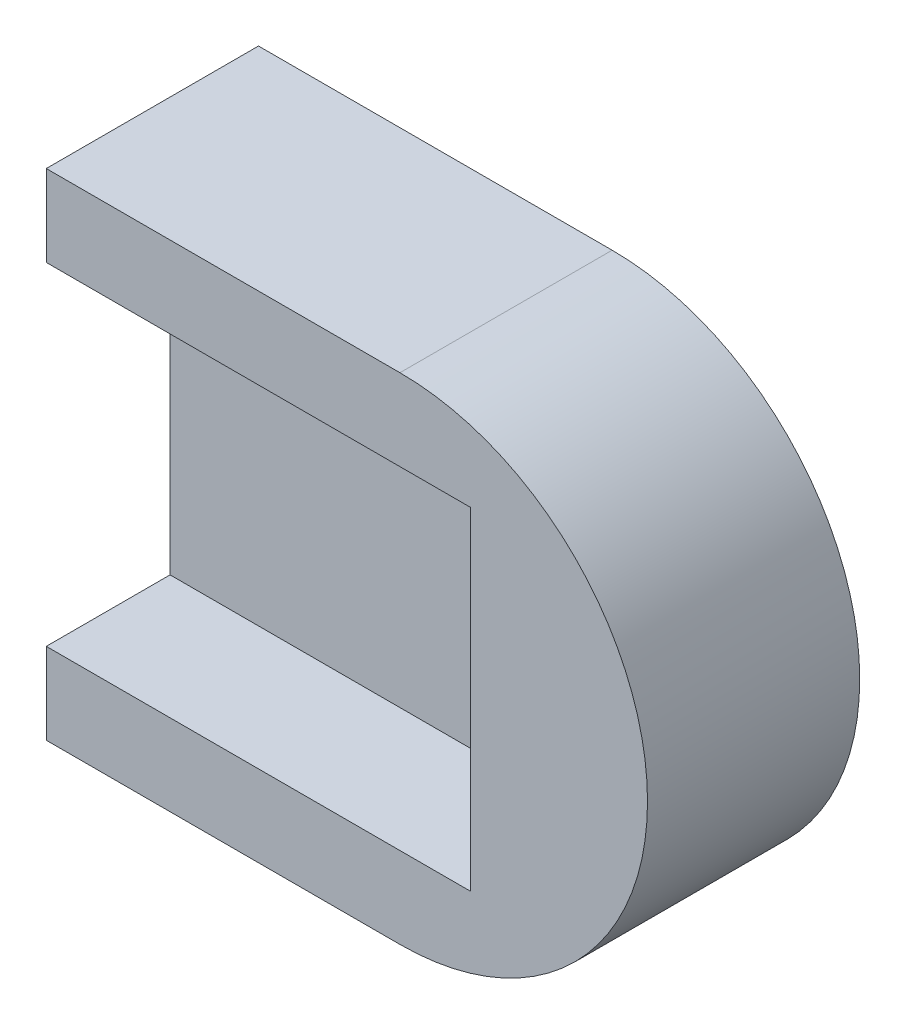
ISO-10303-21;
HEADER;
FILE_DESCRIPTION(('STEP AP214'),'2;1');
FILE_NAME('part.step','',(''),(''),'','','');
FILE_SCHEMA(('AUTOMOTIVE_DESIGN { 1 0 10303 214 1 1 1 1 }'));
ENDSEC;
DATA;
#1=APPLICATION_CONTEXT('core data for automotive mechanical design processes');
#2=APPLICATION_PROTOCOL_DEFINITION('international standard','automotive_design',2000,#1);
#3=PRODUCT_CONTEXT('',#1,'mechanical');
#4=PRODUCT('Part','Part','',(#3));
#5=PRODUCT_RELATED_PRODUCT_CATEGORY('part','',(#4));
#6=PRODUCT_DEFINITION_FORMATION('','',#4);
#7=PRODUCT_DEFINITION_CONTEXT('part definition',#1,'design');
#8=PRODUCT_DEFINITION('design','',#6,#7);
#9=PRODUCT_DEFINITION_SHAPE('','',#8);
#10=(LENGTH_UNIT() NAMED_UNIT(*) SI_UNIT(.MILLI.,.METRE.));
#11=(NAMED_UNIT(*) PLANE_ANGLE_UNIT() SI_UNIT($,.RADIAN.));
#12=(NAMED_UNIT(*) SI_UNIT($,.STERADIAN.) SOLID_ANGLE_UNIT());
#13=UNCERTAINTY_MEASURE_WITH_UNIT(LENGTH_MEASURE(1.E-05),#10,'distance_accuracy_value','');
#14=(GEOMETRIC_REPRESENTATION_CONTEXT(3) GLOBAL_UNCERTAINTY_ASSIGNED_CONTEXT((#13)) GLOBAL_UNIT_ASSIGNED_CONTEXT((#10,
#11,#12)) REPRESENTATION_CONTEXT('',''));
#15=CARTESIAN_POINT('',(0.,0.,0.));
#16=DIRECTION('',(0.,0.,1.));
#17=DIRECTION('',(1.,0.,0.));
#18=AXIS2_PLACEMENT_3D('',#15,#16,#17);
#19=CARTESIAN_POINT('',(-50.,70.,60.));
#20=DIRECTION('',(1.,0.,0.));
#21=DIRECTION('',(0.,0.,-1.));
#22=AXIS2_PLACEMENT_3D('',#19,#20,#21);
#23=PLANE('',#22);
#24=DIRECTION('',(0.,-1.,0.));
#25=VECTOR('',#24,1.);
#26=CARTESIAN_POINT('',(-50.,46.9999999999999,25.));
#27=LINE('',#26,#25);
#28=CARTESIAN_POINT('',(-50.,46.9999999999999,25.));
#29=VERTEX_POINT('',#28);
#30=CARTESIAN_POINT('',(-50.,-47.,25.));
#31=VERTEX_POINT('',#30);
#32=EDGE_CURVE('E117',#29,#31,#27,.T.);
#33=ORIENTED_EDGE('',*,*,#32,.F.);
#34=DIRECTION('',(0.,0.,1.));
#35=VECTOR('',#34,1.);
#36=CARTESIAN_POINT('',(-50.,46.9999999999999,25.));
#37=LINE('',#36,#35);
#38=CARTESIAN_POINT('',(-50.,46.9999999999999,60.));
#39=VERTEX_POINT('',#38);
#40=EDGE_CURVE('E147',#29,#39,#37,.T.);
#41=ORIENTED_EDGE('',*,*,#40,.T.);
#42=DIRECTION('',(0.,-1.,0.));
#43=VECTOR('',#42,1.);
#44=CARTESIAN_POINT('',(-50.,70.,60.));
#45=LINE('',#44,#43);
#46=CARTESIAN_POINT('',(-50.,70.,60.));
#47=VERTEX_POINT('',#46);
#48=EDGE_CURVE('E135',#47,#39,#45,.T.);
#49=ORIENTED_EDGE('',*,*,#48,.F.);
#50=DIRECTION('',(0.,0.,-1.));
#51=VECTOR('',#50,1.);
#52=CARTESIAN_POINT('',(-50.,70.,60.));
#53=LINE('',#52,#51);
#54=CARTESIAN_POINT('',(-50.,70.,0.));
#55=VERTEX_POINT('',#54);
#56=EDGE_CURVE('E142',#47,#55,#53,.T.);
#57=ORIENTED_EDGE('',*,*,#56,.T.);
#58=DIRECTION('',(0.,-1.,0.));
#59=VECTOR('',#58,1.);
#60=CARTESIAN_POINT('',(-50.,70.,0.));
#61=LINE('',#60,#59);
#62=CARTESIAN_POINT('',(-50.,-70.,0.));
#63=VERTEX_POINT('',#62);
#64=EDGE_CURVE('E143',#55,#63,#61,.T.);
#65=ORIENTED_EDGE('',*,*,#64,.T.);
#66=DIRECTION('',(0.,0.,-1.));
#67=VECTOR('',#66,1.);
#68=CARTESIAN_POINT('',(-50.,-70.,60.));
#69=LINE('',#68,#67);
#70=CARTESIAN_POINT('',(-50.,-70.,60.));
#71=VERTEX_POINT('',#70);
#72=EDGE_CURVE('E11',#71,#63,#69,.T.);
#73=ORIENTED_EDGE('',*,*,#72,.F.);
#74=CARTESIAN_POINT('',(-50.,-47.,60.));
#75=VERTEX_POINT('',#74);
#76=EDGE_CURVE('E87',#75,#71,#45,.T.);
#77=ORIENTED_EDGE('',*,*,#76,.F.);
#78=DIRECTION('',(0.,0.,1.));
#79=VECTOR('',#78,1.);
#80=CARTESIAN_POINT('',(-50.,-47.,25.));
#81=LINE('',#80,#79);
#82=EDGE_CURVE('E51',#31,#75,#81,.T.);
#83=ORIENTED_EDGE('',*,*,#82,.F.);
#84=EDGE_LOOP('',(#33,#41,#49,#57,#65,#73,#77,#83));
#85=FACE_BOUND('',#84,.T.);
#86=ADVANCED_FACE('F37',(#85),#23,.F.);
#87=CARTESIAN_POINT('',(-50.,-70.,60.));
#88=DIRECTION('',(0.,1.,0.));
#89=DIRECTION('',(0.,0.,1.));
#90=AXIS2_PLACEMENT_3D('',#87,#88,#89);
#91=PLANE('',#90);
#92=DIRECTION('',(1.,0.,0.));
#93=VECTOR('',#92,1.);
#94=CARTESIAN_POINT('',(-50.,-70.,0.));
#95=LINE('',#94,#93);
#96=CARTESIAN_POINT('',(50.,-70.,0.));
#97=VERTEX_POINT('',#96);
#98=EDGE_CURVE('E146',#63,#97,#95,.T.);
#99=ORIENTED_EDGE('',*,*,#98,.T.);
#100=DIRECTION('',(0.,0.,-1.));
#101=VECTOR('',#100,1.);
#102=CARTESIAN_POINT('',(50.,-70.,60.));
#103=LINE('',#102,#101);
#104=CARTESIAN_POINT('',(50.,-70.,60.));
#105=VERTEX_POINT('',#104);
#106=EDGE_CURVE('E44',#105,#97,#103,.T.);
#107=ORIENTED_EDGE('',*,*,#106,.F.);
#108=DIRECTION('',(1.,0.,0.));
#109=VECTOR('',#108,1.);
#110=CARTESIAN_POINT('',(-50.,-70.,60.));
#111=LINE('',#110,#109);
#112=EDGE_CURVE('E137',#71,#105,#111,.T.);
#113=ORIENTED_EDGE('',*,*,#112,.F.);
#114=ORIENTED_EDGE('',*,*,#72,.T.);
#115=EDGE_LOOP('',(#99,#107,#113,#114));
#116=FACE_BOUND('',#115,.T.);
#117=ADVANCED_FACE('F175',(#116),#91,.F.);
#118=CARTESIAN_POINT('',(50.,0.,60.));
#119=DIRECTION('',(0.,0.,-1.));
#120=DIRECTION('',(-1.,0.,0.));
#121=AXIS2_PLACEMENT_3D('',#118,#119,#120);
#122=CYLINDRICAL_SURFACE('',#121,70.);
#123=CARTESIAN_POINT('',(50.,0.,0.));
#124=DIRECTION('',(0.,0.,1.));
#125=DIRECTION('',(-1.,0.,0.));
#126=AXIS2_PLACEMENT_3D('',#123,#124,#125);
#127=CIRCLE('',#126,70.);
#128=CARTESIAN_POINT('',(50.,70.,0.));
#129=VERTEX_POINT('',#128);
#130=EDGE_CURVE('E149',#97,#129,#127,.T.);
#131=ORIENTED_EDGE('',*,*,#130,.T.);
#132=DIRECTION('',(0.,0.,-1.));
#133=VECTOR('',#132,1.);
#134=CARTESIAN_POINT('',(50.,70.,60.));
#135=LINE('',#134,#133);
#136=CARTESIAN_POINT('',(50.,70.,60.));
#137=VERTEX_POINT('',#136);
#138=EDGE_CURVE('E153',#137,#129,#135,.T.);
#139=ORIENTED_EDGE('',*,*,#138,.F.);
#140=CARTESIAN_POINT('',(50.,0.,60.));
#141=DIRECTION('',(0.,0.,1.));
#142=DIRECTION('',(-1.,0.,0.));
#143=AXIS2_PLACEMENT_3D('',#140,#141,#142);
#144=CIRCLE('',#143,70.);
#145=EDGE_CURVE('E139',#105,#137,#144,.T.);
#146=ORIENTED_EDGE('',*,*,#145,.F.);
#147=ORIENTED_EDGE('',*,*,#106,.T.);
#148=EDGE_LOOP('',(#131,#139,#146,#147));
#149=FACE_BOUND('',#148,.T.);
#150=ADVANCED_FACE('F159',(#149),#122,.T.);
#151=CARTESIAN_POINT('',(-50.,70.,60.));
#152=DIRECTION('',(0.,-1.,0.));
#153=DIRECTION('',(0.,0.,-1.));
#154=AXIS2_PLACEMENT_3D('',#151,#152,#153);
#155=PLANE('',#154);
#156=DIRECTION('',(-1.,0.,0.));
#157=VECTOR('',#156,1.);
#158=CARTESIAN_POINT('',(-50.,70.,0.));
#159=LINE('',#158,#157);
#160=EDGE_CURVE('E81',#129,#55,#159,.T.);
#161=ORIENTED_EDGE('',*,*,#160,.T.);
#162=ORIENTED_EDGE('',*,*,#56,.F.);
#163=DIRECTION('',(-1.,0.,0.));
#164=VECTOR('',#163,1.);
#165=CARTESIAN_POINT('',(-50.,70.,60.));
#166=LINE('',#165,#164);
#167=EDGE_CURVE('E60',#137,#47,#166,.T.);
#168=ORIENTED_EDGE('',*,*,#167,.F.);
#169=ORIENTED_EDGE('',*,*,#138,.T.);
#170=EDGE_LOOP('',(#161,#162,#168,#169));
#171=FACE_BOUND('',#170,.T.);
#172=ADVANCED_FACE('F166',(#171),#155,.F.);
#173=CARTESIAN_POINT('',(50.,0.,60.));
#174=DIRECTION('',(0.,0.,-1.));
#175=DIRECTION('',(-1.,0.,0.));
#176=AXIS2_PLACEMENT_3D('',#173,#174,#175);
#177=PLANE('',#176);
#178=ORIENTED_EDGE('',*,*,#48,.T.);
#179=DIRECTION('',(-1.,0.,0.));
#180=VECTOR('',#179,1.);
#181=CARTESIAN_POINT('',(-50.,46.9999999999999,60.));
#182=LINE('',#181,#180);
#183=CARTESIAN_POINT('',(70.,47.,60.));
#184=VERTEX_POINT('',#183);
#185=EDGE_CURVE('E126',#184,#39,#182,.T.);
#186=ORIENTED_EDGE('',*,*,#185,.F.);
#187=DIRECTION('',(0.,1.,0.));
#188=VECTOR('',#187,1.);
#189=CARTESIAN_POINT('',(70.,47.,60.));
#190=LINE('',#189,#188);
#191=CARTESIAN_POINT('',(70.,-47.,60.));
#192=VERTEX_POINT('',#191);
#193=EDGE_CURVE('E187',#192,#184,#190,.T.);
#194=ORIENTED_EDGE('',*,*,#193,.F.);
#195=DIRECTION('',(1.,0.,0.));
#196=VECTOR('',#195,1.);
#197=CARTESIAN_POINT('',(-50.,-47.,60.));
#198=LINE('',#197,#196);
#199=EDGE_CURVE('E190',#75,#192,#198,.T.);
#200=ORIENTED_EDGE('',*,*,#199,.F.);
#201=ORIENTED_EDGE('',*,*,#76,.T.);
#202=ORIENTED_EDGE('',*,*,#112,.T.);
#203=ORIENTED_EDGE('',*,*,#145,.T.);
#204=ORIENTED_EDGE('',*,*,#167,.T.);
#205=EDGE_LOOP('',(#178,#186,#194,#200,#201,#202,#203,#204));
#206=FACE_BOUND('',#205,.T.);
#207=ADVANCED_FACE('F168',(#206),#177,.F.);
#208=CARTESIAN_POINT('',(50.,0.,0.));
#209=DIRECTION('',(0.,0.,-1.));
#210=DIRECTION('',(-1.,0.,0.));
#211=AXIS2_PLACEMENT_3D('',#208,#209,#210);
#212=PLANE('',#211);
#213=CARTESIAN_POINT('',(30.,0.,0.));
#214=DIRECTION('',(0.,0.,-1.));
#215=DIRECTION('',(-1.,0.,0.));
#216=AXIS2_PLACEMENT_3D('',#213,#214,#215);
#217=CIRCLE('',#216,20.);
#218=CARTESIAN_POINT('',(10.,0.,0.));
#219=VERTEX_POINT('',#218);
#220=EDGE_CURVE('E199',#219,#219,#217,.T.);
#221=ORIENTED_EDGE('',*,*,#220,.F.);
#222=EDGE_LOOP('',(#221));
#223=FACE_BOUND('',#222,.T.);
#224=ORIENTED_EDGE('',*,*,#64,.F.);
#225=ORIENTED_EDGE('',*,*,#160,.F.);
#226=ORIENTED_EDGE('',*,*,#130,.F.);
#227=ORIENTED_EDGE('',*,*,#98,.F.);
#228=EDGE_LOOP('',(#224,#225,#226,#227));
#229=FACE_BOUND('',#228,.T.);
#230=ADVANCED_FACE('F164',(#223,#229),#212,.T.);
#231=CARTESIAN_POINT('',(-50.,46.9999999999999,25.));
#232=DIRECTION('',(0.,1.,0.));
#233=DIRECTION('',(-1.,0.,0.));
#234=AXIS2_PLACEMENT_3D('',#231,#232,#233);
#235=PLANE('',#234);
#236=ORIENTED_EDGE('',*,*,#185,.T.);
#237=ORIENTED_EDGE('',*,*,#40,.F.);
#238=DIRECTION('',(-1.,0.,0.));
#239=VECTOR('',#238,1.);
#240=CARTESIAN_POINT('',(-50.,46.9999999999999,25.));
#241=LINE('',#240,#239);
#242=CARTESIAN_POINT('',(70.,47.,25.));
#243=VERTEX_POINT('',#242);
#244=EDGE_CURVE('E123',#243,#29,#241,.T.);
#245=ORIENTED_EDGE('',*,*,#244,.F.);
#246=DIRECTION('',(0.,0.,1.));
#247=VECTOR('',#246,1.);
#248=CARTESIAN_POINT('',(70.,47.,25.));
#249=LINE('',#248,#247);
#250=EDGE_CURVE('E130',#243,#184,#249,.T.);
#251=ORIENTED_EDGE('',*,*,#250,.T.);
#252=EDGE_LOOP('',(#236,#237,#245,#251));
#253=FACE_BOUND('',#252,.T.);
#254=ADVANCED_FACE('F194',(#253),#235,.F.);
#255=CARTESIAN_POINT('',(70.,47.,25.));
#256=DIRECTION('',(1.,0.,0.));
#257=DIRECTION('',(0.,1.,0.));
#258=AXIS2_PLACEMENT_3D('',#255,#256,#257);
#259=PLANE('',#258);
#260=ORIENTED_EDGE('',*,*,#193,.T.);
#261=ORIENTED_EDGE('',*,*,#250,.F.);
#262=DIRECTION('',(0.,1.,0.));
#263=VECTOR('',#262,1.);
#264=CARTESIAN_POINT('',(70.,47.,25.));
#265=LINE('',#264,#263);
#266=CARTESIAN_POINT('',(70.,-47.,25.));
#267=VERTEX_POINT('',#266);
#268=EDGE_CURVE('E116',#267,#243,#265,.T.);
#269=ORIENTED_EDGE('',*,*,#268,.F.);
#270=DIRECTION('',(0.,0.,1.));
#271=VECTOR('',#270,1.);
#272=CARTESIAN_POINT('',(70.,-47.,25.));
#273=LINE('',#272,#271);
#274=EDGE_CURVE('E112',#267,#192,#273,.T.);
#275=ORIENTED_EDGE('',*,*,#274,.T.);
#276=EDGE_LOOP('',(#260,#261,#269,#275));
#277=FACE_BOUND('',#276,.T.);
#278=ADVANCED_FACE('F196',(#277),#259,.F.);
#279=CARTESIAN_POINT('',(-50.,-47.,25.));
#280=DIRECTION('',(0.,-1.,0.));
#281=DIRECTION('',(0.,0.,-1.));
#282=AXIS2_PLACEMENT_3D('',#279,#280,#281);
#283=PLANE('',#282);
#284=ORIENTED_EDGE('',*,*,#199,.T.);
#285=ORIENTED_EDGE('',*,*,#274,.F.);
#286=DIRECTION('',(1.,0.,0.));
#287=VECTOR('',#286,1.);
#288=CARTESIAN_POINT('',(-50.,-47.,25.));
#289=LINE('',#288,#287);
#290=EDGE_CURVE('E109',#31,#267,#289,.T.);
#291=ORIENTED_EDGE('',*,*,#290,.F.);
#292=ORIENTED_EDGE('',*,*,#82,.T.);
#293=EDGE_LOOP('',(#284,#285,#291,#292));
#294=FACE_BOUND('',#293,.T.);
#295=ADVANCED_FACE('F111',(#294),#283,.F.);
#296=CARTESIAN_POINT('',(0.,0.,25.));
#297=DIRECTION('',(0.,0.,1.));
#298=DIRECTION('',(1.,0.,0.));
#299=AXIS2_PLACEMENT_3D('',#296,#297,#298);
#300=PLANE('',#299);
#301=ORIENTED_EDGE('',*,*,#32,.T.);
#302=ORIENTED_EDGE('',*,*,#290,.T.);
#303=ORIENTED_EDGE('',*,*,#268,.T.);
#304=ORIENTED_EDGE('',*,*,#244,.T.);
#305=EDGE_LOOP('',(#301,#302,#303,#304));
#306=FACE_BOUND('',#305,.T.);
#307=ADVANCED_FACE('F121',(#306),#300,.T.);
#308=CARTESIAN_POINT('',(30.,0.,15.));
#309=DIRECTION('',(0.,0.,-1.));
#310=DIRECTION('',(-1.,0.,0.));
#311=AXIS2_PLACEMENT_3D('',#308,#309,#310);
#312=CYLINDRICAL_SURFACE('',#311,20.);
#313=CARTESIAN_POINT('',(30.,0.,15.));
#314=DIRECTION('',(0.,0.,-1.));
#315=DIRECTION('',(-1.,0.,0.));
#316=AXIS2_PLACEMENT_3D('',#313,#314,#315);
#317=CIRCLE('',#316,20.);
#318=CARTESIAN_POINT('',(10.,0.,15.));
#319=VERTEX_POINT('',#318);
#320=EDGE_CURVE('E197',#319,#319,#317,.T.);
#321=ORIENTED_EDGE('',*,*,#320,.F.);
#322=EDGE_LOOP('',(#321));
#323=FACE_BOUND('',#322,.T.);
#324=ORIENTED_EDGE('',*,*,#220,.T.);
#325=EDGE_LOOP('',(#324));
#326=FACE_BOUND('',#325,.T.);
#327=ADVANCED_FACE('F206',(#323,#326),#312,.F.);
#328=CARTESIAN_POINT('',(30.,0.,15.));
#329=DIRECTION('',(0.,0.,-1.));
#330=DIRECTION('',(-1.,0.,0.));
#331=AXIS2_PLACEMENT_3D('',#328,#329,#330);
#332=PLANE('',#331);
#333=ORIENTED_EDGE('',*,*,#320,.T.);
#334=EDGE_LOOP('',(#333));
#335=FACE_BOUND('',#334,.T.);
#336=ADVANCED_FACE('F224',(#335),#332,.T.);
#337=CLOSED_SHELL('',(#86,#117,#150,#172,#207,#230,#254,#278,#295,#307,#327,#336));
#338=MANIFOLD_SOLID_BREP('B2',#337);
#339=ADVANCED_BREP_SHAPE_REPRESENTATION('',(#18,#338),#14);
#340=SHAPE_DEFINITION_REPRESENTATION(#9,#339);
ENDSEC;
END-ISO-10303-21;
